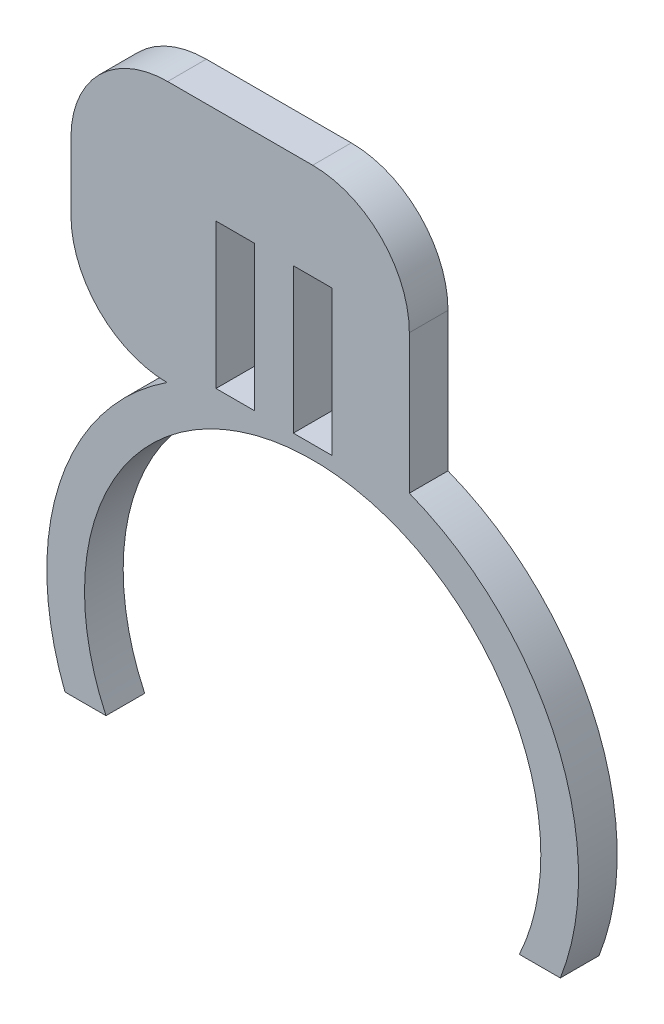
ISO-10303-21;
HEADER;
FILE_DESCRIPTION(('STEP AP214'),'2;1');
FILE_NAME('part.step','',(''),(''),'','','');
FILE_SCHEMA(('AUTOMOTIVE_DESIGN { 1 0 10303 214 1 1 1 1 }'));
ENDSEC;
DATA;
#1=APPLICATION_CONTEXT('core data for automotive mechanical design processes');
#2=APPLICATION_PROTOCOL_DEFINITION('international standard','automotive_design',2000,#1);
#3=PRODUCT_CONTEXT('',#1,'mechanical');
#4=PRODUCT('Part','Part','',(#3));
#5=PRODUCT_RELATED_PRODUCT_CATEGORY('part','',(#4));
#6=PRODUCT_DEFINITION_FORMATION('','',#4);
#7=PRODUCT_DEFINITION_CONTEXT('part definition',#1,'design');
#8=PRODUCT_DEFINITION('design','',#6,#7);
#9=PRODUCT_DEFINITION_SHAPE('','',#8);
#10=(LENGTH_UNIT() NAMED_UNIT(*) SI_UNIT(.MILLI.,.METRE.));
#11=(NAMED_UNIT(*) PLANE_ANGLE_UNIT() SI_UNIT($,.RADIAN.));
#12=(NAMED_UNIT(*) SI_UNIT($,.STERADIAN.) SOLID_ANGLE_UNIT());
#13=UNCERTAINTY_MEASURE_WITH_UNIT(LENGTH_MEASURE(1.E-05),#10,'distance_accuracy_value','');
#14=(GEOMETRIC_REPRESENTATION_CONTEXT(3) GLOBAL_UNCERTAINTY_ASSIGNED_CONTEXT((#13)) GLOBAL_UNIT_ASSIGNED_CONTEXT((#10,
#11,#12)) REPRESENTATION_CONTEXT('',''));
#15=CARTESIAN_POINT('',(0.,0.,0.));
#16=DIRECTION('',(0.,0.,1.));
#17=DIRECTION('',(1.,0.,0.));
#18=AXIS2_PLACEMENT_3D('',#15,#16,#17);
#19=CARTESIAN_POINT('',(0.,0.,5.08));
#20=DIRECTION('',(0.,0.,-1.));
#21=DIRECTION('',(-1.,0.,0.));
#22=AXIS2_PLACEMENT_3D('',#19,#20,#21);
#23=CYLINDRICAL_SURFACE('',#22,34.925);
#24=DIRECTION('',(0.,0.,-1.));
#25=VECTOR('',#24,1.);
#26=CARTESIAN_POINT('',(-19.1450130582353,29.21,5.08));
#27=LINE('',#26,#25);
#28=CARTESIAN_POINT('',(-19.1450130582353,29.21,0.));
#29=VERTEX_POINT('',#28);
#30=CARTESIAN_POINT('',(-19.1450130582353,29.21,5.08));
#31=VERTEX_POINT('',#30);
#32=EDGE_CURVE('E215',#29,#31,#27,.F.);
#33=ORIENTED_EDGE('',*,*,#32,.F.);
#34=CARTESIAN_POINT('',(0.,0.,0.));
#35=DIRECTION('',(0.,0.,1.));
#36=DIRECTION('',(1.,0.,0.));
#37=AXIS2_PLACEMENT_3D('',#34,#35,#36);
#38=CIRCLE('',#37,34.925);
#39=CARTESIAN_POINT('',(-32.5340686819217,-12.7,0.));
#40=VERTEX_POINT('',#39);
#41=EDGE_CURVE('E283',#29,#40,#38,.T.);
#42=ORIENTED_EDGE('',*,*,#41,.T.);
#43=DIRECTION('',(0.,0.,-1.));
#44=VECTOR('',#43,1.);
#45=CARTESIAN_POINT('',(-32.5340686819217,-12.7,5.08));
#46=LINE('',#45,#44);
#47=CARTESIAN_POINT('',(-32.5340686819217,-12.7,5.08));
#48=VERTEX_POINT('',#47);
#49=EDGE_CURVE('E223',#40,#48,#46,.F.);
#50=ORIENTED_EDGE('',*,*,#49,.T.);
#51=CARTESIAN_POINT('',(0.,0.,5.08));
#52=DIRECTION('',(0.,0.,1.));
#53=DIRECTION('',(1.,0.,0.));
#54=AXIS2_PLACEMENT_3D('',#51,#52,#53);
#55=CIRCLE('',#54,34.925);
#56=EDGE_CURVE('E279',#31,#48,#55,.T.);
#57=ORIENTED_EDGE('',*,*,#56,.F.);
#58=EDGE_LOOP('',(#33,#42,#50,#57));
#59=FACE_BOUND('',#58,.T.);
#60=ADVANCED_FACE('F34',(#59),#23,.T.);
#61=CARTESIAN_POINT('',(32.5340686819217,-12.6999999999999,5.08));
#62=VERTEX_POINT('',#61);
#63=CARTESIAN_POINT('',(12.7,32.5340686819218,5.08));
#64=VERTEX_POINT('',#63);
#65=EDGE_CURVE('E282',#62,#64,#55,.T.);
#66=ORIENTED_EDGE('',*,*,#65,.F.);
#67=DIRECTION('',(0.,0.,-1.));
#68=VECTOR('',#67,1.);
#69=CARTESIAN_POINT('',(32.5340686819217,-12.6999999999999,5.08));
#70=LINE('',#69,#68);
#71=CARTESIAN_POINT('',(32.5340686819217,-12.6999999999999,0.));
#72=VERTEX_POINT('',#71);
#73=EDGE_CURVE('E227',#62,#72,#70,.T.);
#74=ORIENTED_EDGE('',*,*,#73,.T.);
#75=CARTESIAN_POINT('',(12.7,32.5340686819218,0.));
#76=VERTEX_POINT('',#75);
#77=EDGE_CURVE('E278',#72,#76,#38,.T.);
#78=ORIENTED_EDGE('',*,*,#77,.T.);
#79=DIRECTION('',(0.,0.,-1.));
#80=VECTOR('',#79,1.);
#81=CARTESIAN_POINT('',(12.7,32.5340686819218,5.08));
#82=LINE('',#81,#80);
#83=EDGE_CURVE('E275',#64,#76,#82,.T.);
#84=ORIENTED_EDGE('',*,*,#83,.F.);
#85=EDGE_LOOP('',(#66,#74,#78,#84));
#86=FACE_BOUND('',#85,.T.);
#87=ADVANCED_FACE('F338',(#86),#23,.T.);
#88=CARTESIAN_POINT('',(0.,0.,5.08));
#89=DIRECTION('',(0.,0.,1.));
#90=DIRECTION('',(1.,0.,0.));
#91=AXIS2_PLACEMENT_3D('',#88,#89,#90);
#92=PLANE('',#91);
#93=DIRECTION('',(0.,1.,0.));
#94=VECTOR('',#93,1.);
#95=CARTESIAN_POINT('',(-7.62000000000002,0.,5.08));
#96=LINE('',#95,#94);
#97=CARTESIAN_POINT('',(-7.62000000000002,31.75,5.08));
#98=VERTEX_POINT('',#97);
#99=CARTESIAN_POINT('',(-7.62000000000004,50.8000000000001,5.08));
#100=VERTEX_POINT('',#99);
#101=EDGE_CURVE('E208',#98,#100,#96,.T.);
#102=ORIENTED_EDGE('',*,*,#101,.F.);
#103=DIRECTION('',(1.,0.,0.));
#104=VECTOR('',#103,1.);
#105=CARTESIAN_POINT('',(0.,31.7500000000001,5.08));
#106=LINE('',#105,#104);
#107=CARTESIAN_POINT('',(-12.7,31.75,5.08));
#108=VERTEX_POINT('',#107);
#109=EDGE_CURVE('E201',#108,#98,#106,.T.);
#110=ORIENTED_EDGE('',*,*,#109,.F.);
#111=DIRECTION('',(0.,-1.,0.));
#112=VECTOR('',#111,1.);
#113=CARTESIAN_POINT('',(-12.7,1.11022302462516E-13,5.08));
#114=LINE('',#113,#112);
#115=CARTESIAN_POINT('',(-12.7,50.8000000000001,5.08));
#116=VERTEX_POINT('',#115);
#117=EDGE_CURVE('E176',#116,#108,#114,.T.);
#118=ORIENTED_EDGE('',*,*,#117,.F.);
#119=DIRECTION('',(-1.,0.,0.));
#120=VECTOR('',#119,1.);
#121=CARTESIAN_POINT('',(0.,50.8,5.08));
#122=LINE('',#121,#120);
#123=EDGE_CURVE('E206',#100,#116,#122,.T.);
#124=ORIENTED_EDGE('',*,*,#123,.F.);
#125=EDGE_LOOP('',(#102,#110,#118,#124));
#126=FACE_BOUND('',#125,.T.);
#127=DIRECTION('',(0.,-1.,0.));
#128=VECTOR('',#127,1.);
#129=CARTESIAN_POINT('',(12.7,63.5,5.08));
#130=LINE('',#129,#128);
#131=CARTESIAN_POINT('',(12.7,50.8,5.08));
#132=VERTEX_POINT('',#131);
#133=EDGE_CURVE('E271',#132,#64,#130,.T.);
#134=ORIENTED_EDGE('',*,*,#133,.F.);
#135=CARTESIAN_POINT('',(0.,50.8,5.08));
#136=DIRECTION('',(0.,0.,1.));
#137=DIRECTION('',(1.,0.,0.));
#138=AXIS2_PLACEMENT_3D('',#135,#136,#137);
#139=CIRCLE('',#138,12.7);
#140=CARTESIAN_POINT('',(0.,63.4999999999999,5.08));
#141=VERTEX_POINT('',#140);
#142=EDGE_CURVE('E305',#132,#141,#139,.T.);
#143=ORIENTED_EDGE('',*,*,#142,.T.);
#144=DIRECTION('',(1.,0.,0.));
#145=VECTOR('',#144,1.);
#146=CARTESIAN_POINT('',(-12.7,63.5,5.08));
#147=LINE('',#146,#145);
#148=CARTESIAN_POINT('',(-19.05,63.5,5.08));
#149=VERTEX_POINT('',#148);
#150=EDGE_CURVE('E268',#149,#141,#147,.T.);
#151=ORIENTED_EDGE('',*,*,#150,.F.);
#152=CARTESIAN_POINT('',(-19.05,50.8,5.08));
#153=DIRECTION('',(0.,0.,1.));
#154=DIRECTION('',(1.,0.,0.));
#155=AXIS2_PLACEMENT_3D('',#152,#153,#154);
#156=CIRCLE('',#155,12.7);
#157=CARTESIAN_POINT('',(-31.7500000000001,50.8,5.08));
#158=VERTEX_POINT('',#157);
#159=EDGE_CURVE('E49',#149,#158,#156,.T.);
#160=ORIENTED_EDGE('',*,*,#159,.T.);
#161=DIRECTION('',(0.,1.,0.));
#162=VECTOR('',#161,1.);
#163=CARTESIAN_POINT('',(-31.75,63.5,5.08));
#164=LINE('',#163,#162);
#165=CARTESIAN_POINT('',(-31.7500000000001,41.9096445823797,5.08));
#166=VERTEX_POINT('',#165);
#167=EDGE_CURVE('E213',#166,#158,#164,.T.);
#168=ORIENTED_EDGE('',*,*,#167,.F.);
#169=CARTESIAN_POINT('',(-19.05,41.9096445823797,5.08));
#170=DIRECTION('',(0.,0.,1.));
#171=DIRECTION('',(1.,0.,0.));
#172=AXIS2_PLACEMENT_3D('',#169,#170,#171);
#173=CIRCLE('',#172,12.7);
#174=EDGE_CURVE('E57',#166,#31,#173,.T.);
#175=ORIENTED_EDGE('',*,*,#174,.T.);
#176=ORIENTED_EDGE('',*,*,#56,.T.);
#177=DIRECTION('',(-1.,0.,0.));
#178=VECTOR('',#177,1.);
#179=CARTESIAN_POINT('',(0.,-12.6999999999999,5.08));
#180=LINE('',#179,#178);
#181=CARTESIAN_POINT('',(-27.1483108866832,-12.6999999999999,5.08));
#182=VERTEX_POINT('',#181);
#183=EDGE_CURVE('E220',#182,#48,#180,.T.);
#184=ORIENTED_EDGE('',*,*,#183,.F.);
#185=CARTESIAN_POINT('',(0.,0.,5.08));
#186=DIRECTION('',(0.,0.,1.));
#187=DIRECTION('',(1.,0.,0.));
#188=AXIS2_PLACEMENT_3D('',#185,#186,#187);
#189=CIRCLE('',#188,29.972);
#190=CARTESIAN_POINT('',(27.1483108866831,-12.6999999999999,5.08));
#191=VERTEX_POINT('',#190);
#192=EDGE_CURVE('E262',#191,#182,#189,.T.);
#193=ORIENTED_EDGE('',*,*,#192,.F.);
#194=EDGE_CURVE('E224',#62,#191,#180,.T.);
#195=ORIENTED_EDGE('',*,*,#194,.F.);
#196=ORIENTED_EDGE('',*,*,#65,.T.);
#197=EDGE_LOOP('',(#134,#143,#151,#160,#168,#175,#176,#184,#193,#195,#196));
#198=FACE_BOUND('',#197,.T.);
#199=DIRECTION('',(0.,1.,0.));
#200=VECTOR('',#199,1.);
#201=CARTESIAN_POINT('',(2.53999999999999,1.11022302462516E-13,5.08));
#202=LINE('',#201,#200);
#203=CARTESIAN_POINT('',(2.53999999999999,31.7500000000001,5.08));
#204=VERTEX_POINT('',#203);
#205=CARTESIAN_POINT('',(2.53999999999999,50.8,5.08));
#206=VERTEX_POINT('',#205);
#207=EDGE_CURVE('E257',#204,#206,#202,.T.);
#208=ORIENTED_EDGE('',*,*,#207,.F.);
#209=DIRECTION('',(1.,0.,0.));
#210=VECTOR('',#209,1.);
#211=CARTESIAN_POINT('',(0.,31.7500000000001,5.08));
#212=LINE('',#211,#210);
#213=CARTESIAN_POINT('',(-2.54000000000001,31.75,5.08));
#214=VERTEX_POINT('',#213);
#215=EDGE_CURVE('E244',#214,#204,#212,.T.);
#216=ORIENTED_EDGE('',*,*,#215,.F.);
#217=DIRECTION('',(0.,-1.,0.));
#218=VECTOR('',#217,1.);
#219=CARTESIAN_POINT('',(-2.54000000000001,0.,5.08));
#220=LINE('',#219,#218);
#221=CARTESIAN_POINT('',(-2.54000000000001,50.8,5.08));
#222=VERTEX_POINT('',#221);
#223=EDGE_CURVE('E252',#222,#214,#220,.T.);
#224=ORIENTED_EDGE('',*,*,#223,.F.);
#225=DIRECTION('',(-1.,0.,0.));
#226=VECTOR('',#225,1.);
#227=CARTESIAN_POINT('',(0.,50.8,5.08));
#228=LINE('',#227,#226);
#229=EDGE_CURVE('E255',#206,#222,#228,.T.);
#230=ORIENTED_EDGE('',*,*,#229,.F.);
#231=EDGE_LOOP('',(#208,#216,#224,#230));
#232=FACE_BOUND('',#231,.T.);
#233=ADVANCED_FACE('F312',(#126,#198,#232),#92,.T.);
#234=CARTESIAN_POINT('',(0.,0.,0.));
#235=DIRECTION('',(0.,0.,1.));
#236=DIRECTION('',(1.,0.,0.));
#237=AXIS2_PLACEMENT_3D('',#234,#235,#236);
#238=PLANE('',#237);
#239=DIRECTION('',(-1.,0.,0.));
#240=VECTOR('',#239,1.);
#241=CARTESIAN_POINT('',(-7.62000000000002,31.75,0.));
#242=LINE('',#241,#240);
#243=CARTESIAN_POINT('',(-7.62000000000002,31.75,0.));
#244=VERTEX_POINT('',#243);
#245=CARTESIAN_POINT('',(-12.7,31.75,0.));
#246=VERTEX_POINT('',#245);
#247=EDGE_CURVE('E184',#244,#246,#242,.T.);
#248=ORIENTED_EDGE('',*,*,#247,.F.);
#249=DIRECTION('',(0.,-1.,0.));
#250=VECTOR('',#249,1.);
#251=CARTESIAN_POINT('',(-7.62000000000002,31.75,0.));
#252=LINE('',#251,#250);
#253=CARTESIAN_POINT('',(-7.62000000000004,50.8000000000001,0.));
#254=VERTEX_POINT('',#253);
#255=EDGE_CURVE('E189',#254,#244,#252,.T.);
#256=ORIENTED_EDGE('',*,*,#255,.F.);
#257=DIRECTION('',(1.,0.,0.));
#258=VECTOR('',#257,1.);
#259=CARTESIAN_POINT('',(-7.62000000000004,50.8000000000001,0.));
#260=LINE('',#259,#258);
#261=CARTESIAN_POINT('',(-12.7,50.8000000000001,0.));
#262=VERTEX_POINT('',#261);
#263=EDGE_CURVE('E194',#262,#254,#260,.T.);
#264=ORIENTED_EDGE('',*,*,#263,.F.);
#265=DIRECTION('',(0.,1.,0.));
#266=VECTOR('',#265,1.);
#267=CARTESIAN_POINT('',(-12.7,31.75,0.));
#268=LINE('',#267,#266);
#269=EDGE_CURVE('E173',#246,#262,#268,.T.);
#270=ORIENTED_EDGE('',*,*,#269,.F.);
#271=EDGE_LOOP('',(#248,#256,#264,#270));
#272=FACE_BOUND('',#271,.T.);
#273=DIRECTION('',(-1.,0.,0.));
#274=VECTOR('',#273,1.);
#275=CARTESIAN_POINT('',(-12.7,63.5,0.));
#276=LINE('',#275,#274);
#277=CARTESIAN_POINT('',(0.,63.4999999999999,0.));
#278=VERTEX_POINT('',#277);
#279=CARTESIAN_POINT('',(-19.05,63.5,0.));
#280=VERTEX_POINT('',#279);
#281=EDGE_CURVE('E265',#278,#280,#276,.T.);
#282=ORIENTED_EDGE('',*,*,#281,.F.);
#283=CARTESIAN_POINT('',(0.,50.8,0.));
#284=DIRECTION('',(0.,0.,1.));
#285=DIRECTION('',(1.,0.,0.));
#286=AXIS2_PLACEMENT_3D('',#283,#284,#285);
#287=CIRCLE('',#286,12.7);
#288=CARTESIAN_POINT('',(12.7,50.8,0.));
#289=VERTEX_POINT('',#288);
#290=EDGE_CURVE('E299',#278,#289,#287,.F.);
#291=ORIENTED_EDGE('',*,*,#290,.T.);
#292=DIRECTION('',(0.,-1.,0.));
#293=VECTOR('',#292,1.);
#294=CARTESIAN_POINT('',(12.7,63.5,0.));
#295=LINE('',#294,#293);
#296=EDGE_CURVE('E273',#289,#76,#295,.T.);
#297=ORIENTED_EDGE('',*,*,#296,.T.);
#298=ORIENTED_EDGE('',*,*,#77,.F.);
#299=DIRECTION('',(1.,0.,0.));
#300=VECTOR('',#299,1.);
#301=CARTESIAN_POINT('',(-65.502632377882,-12.6999999999999,0.));
#302=LINE('',#301,#300);
#303=CARTESIAN_POINT('',(27.1483108866831,-12.6999999999999,0.));
#304=VERTEX_POINT('',#303);
#305=EDGE_CURVE('E217',#304,#72,#302,.T.);
#306=ORIENTED_EDGE('',*,*,#305,.F.);
#307=CARTESIAN_POINT('',(0.,0.,0.));
#308=DIRECTION('',(0.,0.,-1.));
#309=DIRECTION('',(-1.,0.,0.));
#310=AXIS2_PLACEMENT_3D('',#307,#308,#309);
#311=CIRCLE('',#310,29.972);
#312=CARTESIAN_POINT('',(-27.1483108866832,-12.6999999999999,0.));
#313=VERTEX_POINT('',#312);
#314=EDGE_CURVE('E259',#313,#304,#311,.T.);
#315=ORIENTED_EDGE('',*,*,#314,.F.);
#316=EDGE_CURVE('E219',#40,#313,#302,.T.);
#317=ORIENTED_EDGE('',*,*,#316,.F.);
#318=ORIENTED_EDGE('',*,*,#41,.F.);
#319=CARTESIAN_POINT('',(-19.05,41.9096445823797,0.));
#320=DIRECTION('',(0.,0.,1.));
#321=DIRECTION('',(1.,0.,0.));
#322=AXIS2_PLACEMENT_3D('',#319,#320,#321);
#323=CIRCLE('',#322,12.7);
#324=CARTESIAN_POINT('',(-31.7500000000001,41.9096445823797,0.));
#325=VERTEX_POINT('',#324);
#326=EDGE_CURVE('E295',#29,#325,#323,.F.);
#327=ORIENTED_EDGE('',*,*,#326,.T.);
#328=DIRECTION('',(0.,-1.,0.));
#329=VECTOR('',#328,1.);
#330=CARTESIAN_POINT('',(-31.75,63.5,0.));
#331=LINE('',#330,#329);
#332=CARTESIAN_POINT('',(-31.7500000000001,50.8,0.));
#333=VERTEX_POINT('',#332);
#334=EDGE_CURVE('E210',#333,#325,#331,.T.);
#335=ORIENTED_EDGE('',*,*,#334,.F.);
#336=CARTESIAN_POINT('',(-19.05,50.8,0.));
#337=DIRECTION('',(0.,0.,1.));
#338=DIRECTION('',(1.,0.,0.));
#339=AXIS2_PLACEMENT_3D('',#336,#337,#338);
#340=CIRCLE('',#339,12.7);
#341=EDGE_CURVE('E297',#333,#280,#340,.F.);
#342=ORIENTED_EDGE('',*,*,#341,.T.);
#343=EDGE_LOOP('',(#282,#291,#297,#298,#306,#315,#317,#318,#327,#335,#342));
#344=FACE_BOUND('',#343,.T.);
#345=DIRECTION('',(-1.,0.,0.));
#346=VECTOR('',#345,1.);
#347=CARTESIAN_POINT('',(-2.54000000000001,31.75,0.));
#348=LINE('',#347,#346);
#349=CARTESIAN_POINT('',(2.53999999999999,31.7500000000001,0.));
#350=VERTEX_POINT('',#349);
#351=CARTESIAN_POINT('',(-2.54000000000001,31.75,0.));
#352=VERTEX_POINT('',#351);
#353=EDGE_CURVE('E232',#350,#352,#348,.T.);
#354=ORIENTED_EDGE('',*,*,#353,.F.);
#355=DIRECTION('',(0.,-1.,0.));
#356=VECTOR('',#355,1.);
#357=CARTESIAN_POINT('',(2.53999999999999,50.8,0.));
#358=LINE('',#357,#356);
#359=CARTESIAN_POINT('',(2.53999999999999,50.8,0.));
#360=VERTEX_POINT('',#359);
#361=EDGE_CURVE('E230',#360,#350,#358,.T.);
#362=ORIENTED_EDGE('',*,*,#361,.F.);
#363=DIRECTION('',(1.,0.,0.));
#364=VECTOR('',#363,1.);
#365=CARTESIAN_POINT('',(-2.54000000000001,50.8,0.));
#366=LINE('',#365,#364);
#367=CARTESIAN_POINT('',(-2.54000000000001,50.8,0.));
#368=VERTEX_POINT('',#367);
#369=EDGE_CURVE('E238',#368,#360,#366,.T.);
#370=ORIENTED_EDGE('',*,*,#369,.F.);
#371=DIRECTION('',(0.,1.,0.));
#372=VECTOR('',#371,1.);
#373=CARTESIAN_POINT('',(-2.54000000000001,50.8,0.));
#374=LINE('',#373,#372);
#375=EDGE_CURVE('E235',#352,#368,#374,.T.);
#376=ORIENTED_EDGE('',*,*,#375,.F.);
#377=EDGE_LOOP('',(#354,#362,#370,#376));
#378=FACE_BOUND('',#377,.T.);
#379=ADVANCED_FACE('F191',(#272,#344,#378),#238,.F.);
#380=CARTESIAN_POINT('',(12.7,63.5,0.));
#381=DIRECTION('',(-1.,0.,0.));
#382=DIRECTION('',(0.,0.,1.));
#383=AXIS2_PLACEMENT_3D('',#380,#381,#382);
#384=PLANE('',#383);
#385=ORIENTED_EDGE('',*,*,#296,.F.);
#386=DIRECTION('',(0.,0.,-1.));
#387=VECTOR('',#386,1.);
#388=CARTESIAN_POINT('',(12.7,50.8,5.08));
#389=LINE('',#388,#387);
#390=EDGE_CURVE('E301',#289,#132,#389,.F.);
#391=ORIENTED_EDGE('',*,*,#390,.T.);
#392=ORIENTED_EDGE('',*,*,#133,.T.);
#393=ORIENTED_EDGE('',*,*,#83,.T.);
#394=EDGE_LOOP('',(#385,#391,#392,#393));
#395=FACE_BOUND('',#394,.T.);
#396=ADVANCED_FACE('F340',(#395),#384,.F.);
#397=CARTESIAN_POINT('',(0.,63.4999999999999,0.));
#398=DIRECTION('',(0.,1.,0.));
#399=DIRECTION('',(0.,0.,1.));
#400=AXIS2_PLACEMENT_3D('',#397,#398,#399);
#401=PLANE('',#400);
#402=ORIENTED_EDGE('',*,*,#150,.T.);
#403=DIRECTION('',(0.,0.,-1.));
#404=VECTOR('',#403,1.);
#405=CARTESIAN_POINT('',(0.,63.4999999999999,0.));
#406=LINE('',#405,#404);
#407=EDGE_CURVE('E292',#141,#278,#406,.T.);
#408=ORIENTED_EDGE('',*,*,#407,.T.);
#409=ORIENTED_EDGE('',*,*,#281,.T.);
#410=DIRECTION('',(0.,0.,-1.));
#411=VECTOR('',#410,1.);
#412=CARTESIAN_POINT('',(-19.05,63.5,0.));
#413=LINE('',#412,#411);
#414=EDGE_CURVE('E290',#280,#149,#413,.F.);
#415=ORIENTED_EDGE('',*,*,#414,.T.);
#416=EDGE_LOOP('',(#402,#408,#409,#415));
#417=FACE_BOUND('',#416,.T.);
#418=ADVANCED_FACE('F348',(#417),#401,.T.);
#419=CARTESIAN_POINT('',(0.,0.,50.8));
#420=DIRECTION('',(0.,0.,-1.));
#421=DIRECTION('',(-1.,0.,0.));
#422=AXIS2_PLACEMENT_3D('',#419,#420,#421);
#423=CYLINDRICAL_SURFACE('',#422,29.972);
#424=ORIENTED_EDGE('',*,*,#314,.T.);
#425=DIRECTION('',(0.,0.,-1.));
#426=VECTOR('',#425,1.);
#427=CARTESIAN_POINT('',(27.1483108866831,-12.6999999999999,50.8));
#428=LINE('',#427,#426);
#429=EDGE_CURVE('E287',#304,#191,#428,.F.);
#430=ORIENTED_EDGE('',*,*,#429,.T.);
#431=ORIENTED_EDGE('',*,*,#192,.T.);
#432=DIRECTION('',(0.,0.,-1.));
#433=VECTOR('',#432,1.);
#434=CARTESIAN_POINT('',(-27.1483108866832,-12.6999999999999,50.8));
#435=LINE('',#434,#433);
#436=EDGE_CURVE('E281',#182,#313,#435,.T.);
#437=ORIENTED_EDGE('',*,*,#436,.T.);
#438=EDGE_LOOP('',(#424,#430,#431,#437));
#439=FACE_BOUND('',#438,.T.);
#440=ADVANCED_FACE('F328',(#439),#423,.F.);
#441=CARTESIAN_POINT('',(2.53999999999999,50.8,50.8));
#442=DIRECTION('',(1.,0.,0.));
#443=DIRECTION('',(0.,1.,0.));
#444=AXIS2_PLACEMENT_3D('',#441,#442,#443);
#445=PLANE('',#444);
#446=ORIENTED_EDGE('',*,*,#207,.T.);
#447=DIRECTION('',(0.,0.,-1.));
#448=VECTOR('',#447,1.);
#449=CARTESIAN_POINT('',(2.53999999999999,50.8,50.8));
#450=LINE('',#449,#448);
#451=EDGE_CURVE('E242',#206,#360,#450,.T.);
#452=ORIENTED_EDGE('',*,*,#451,.T.);
#453=ORIENTED_EDGE('',*,*,#361,.T.);
#454=DIRECTION('',(0.,0.,-1.));
#455=VECTOR('',#454,1.);
#456=CARTESIAN_POINT('',(2.53999999999999,31.7500000000001,50.8));
#457=LINE('',#456,#455);
#458=EDGE_CURVE('E241',#204,#350,#457,.T.);
#459=ORIENTED_EDGE('',*,*,#458,.F.);
#460=EDGE_LOOP('',(#446,#452,#453,#459));
#461=FACE_BOUND('',#460,.T.);
#462=ADVANCED_FACE('F375',(#461),#445,.F.);
#463=CARTESIAN_POINT('',(-2.54000000000001,50.8,50.8));
#464=DIRECTION('',(0.,1.,0.));
#465=DIRECTION('',(0.,0.,1.));
#466=AXIS2_PLACEMENT_3D('',#463,#464,#465);
#467=PLANE('',#466);
#468=ORIENTED_EDGE('',*,*,#229,.T.);
#469=DIRECTION('',(0.,0.,-1.));
#470=VECTOR('',#469,1.);
#471=CARTESIAN_POINT('',(-2.54000000000001,50.8,50.8));
#472=LINE('',#471,#470);
#473=EDGE_CURVE('E245',#222,#368,#472,.T.);
#474=ORIENTED_EDGE('',*,*,#473,.T.);
#475=ORIENTED_EDGE('',*,*,#369,.T.);
#476=ORIENTED_EDGE('',*,*,#451,.F.);
#477=EDGE_LOOP('',(#468,#474,#475,#476));
#478=FACE_BOUND('',#477,.T.);
#479=ADVANCED_FACE('F378',(#478),#467,.F.);
#480=CARTESIAN_POINT('',(-2.54000000000001,50.8,50.8));
#481=DIRECTION('',(-1.,0.,0.));
#482=DIRECTION('',(0.,-1.,0.));
#483=AXIS2_PLACEMENT_3D('',#480,#481,#482);
#484=PLANE('',#483);
#485=ORIENTED_EDGE('',*,*,#223,.T.);
#486=DIRECTION('',(0.,0.,-1.));
#487=VECTOR('',#486,1.);
#488=CARTESIAN_POINT('',(-2.54000000000001,31.75,50.8));
#489=LINE('',#488,#487);
#490=EDGE_CURVE('E247',#214,#352,#489,.T.);
#491=ORIENTED_EDGE('',*,*,#490,.T.);
#492=ORIENTED_EDGE('',*,*,#375,.T.);
#493=ORIENTED_EDGE('',*,*,#473,.F.);
#494=EDGE_LOOP('',(#485,#491,#492,#493));
#495=FACE_BOUND('',#494,.T.);
#496=ADVANCED_FACE('F383',(#495),#484,.F.);
#497=CARTESIAN_POINT('',(-2.54000000000001,31.75,50.8));
#498=DIRECTION('',(0.,-1.,0.));
#499=DIRECTION('',(0.,0.,-1.));
#500=AXIS2_PLACEMENT_3D('',#497,#498,#499);
#501=PLANE('',#500);
#502=ORIENTED_EDGE('',*,*,#215,.T.);
#503=ORIENTED_EDGE('',*,*,#458,.T.);
#504=ORIENTED_EDGE('',*,*,#353,.T.);
#505=ORIENTED_EDGE('',*,*,#490,.F.);
#506=EDGE_LOOP('',(#502,#503,#504,#505));
#507=FACE_BOUND('',#506,.T.);
#508=ADVANCED_FACE('F380',(#507),#501,.F.);
#509=CARTESIAN_POINT('',(-65.502632377882,-12.6999999999999,50.8));
#510=DIRECTION('',(0.,1.,0.));
#511=DIRECTION('',(-1.,0.,0.));
#512=AXIS2_PLACEMENT_3D('',#509,#510,#511);
#513=PLANE('',#512);
#514=ORIENTED_EDGE('',*,*,#316,.T.);
#515=ORIENTED_EDGE('',*,*,#436,.F.);
#516=ORIENTED_EDGE('',*,*,#183,.T.);
#517=ORIENTED_EDGE('',*,*,#49,.F.);
#518=EDGE_LOOP('',(#514,#515,#516,#517));
#519=FACE_BOUND('',#518,.T.);
#520=ADVANCED_FACE('F324',(#519),#513,.F.);
#521=ORIENTED_EDGE('',*,*,#194,.T.);
#522=ORIENTED_EDGE('',*,*,#429,.F.);
#523=ORIENTED_EDGE('',*,*,#305,.T.);
#524=ORIENTED_EDGE('',*,*,#73,.F.);
#525=EDGE_LOOP('',(#521,#522,#523,#524));
#526=FACE_BOUND('',#525,.T.);
#527=ADVANCED_FACE('F331',(#526),#513,.F.);
#528=CARTESIAN_POINT('',(-31.75,0.,0.));
#529=DIRECTION('',(-1.,0.,0.));
#530=DIRECTION('',(0.,0.,1.));
#531=AXIS2_PLACEMENT_3D('',#528,#529,#530);
#532=PLANE('',#531);
#533=ORIENTED_EDGE('',*,*,#167,.T.);
#534=DIRECTION('',(0.,0.,-1.));
#535=VECTOR('',#534,1.);
#536=CARTESIAN_POINT('',(-31.7500000000001,50.8,0.));
#537=LINE('',#536,#535);
#538=EDGE_CURVE('E11',#158,#333,#537,.T.);
#539=ORIENTED_EDGE('',*,*,#538,.T.);
#540=ORIENTED_EDGE('',*,*,#334,.T.);
#541=DIRECTION('',(0.,0.,1.));
#542=VECTOR('',#541,1.);
#543=CARTESIAN_POINT('',(-31.7500000000001,41.9096445823797,5.08));
#544=LINE('',#543,#542);
#545=EDGE_CURVE('E42',#325,#166,#544,.T.);
#546=ORIENTED_EDGE('',*,*,#545,.T.);
#547=EDGE_LOOP('',(#533,#539,#540,#546));
#548=FACE_BOUND('',#547,.T.);
#549=ADVANCED_FACE('F307',(#548),#532,.T.);
#550=CARTESIAN_POINT('',(-7.62000000000002,31.75,19.05));
#551=DIRECTION('',(0.999999999999999,0.,0.));
#552=DIRECTION('',(0.,0.,-1.));
#553=AXIS2_PLACEMENT_3D('',#550,#551,#552);
#554=PLANE('',#553);
#555=ORIENTED_EDGE('',*,*,#101,.T.);
#556=DIRECTION('',(0.,0.,-1.));
#557=VECTOR('',#556,1.);
#558=CARTESIAN_POINT('',(-7.62000000000004,50.8000000000001,19.05));
#559=LINE('',#558,#557);
#560=EDGE_CURVE('E199',#100,#254,#559,.T.);
#561=ORIENTED_EDGE('',*,*,#560,.T.);
#562=ORIENTED_EDGE('',*,*,#255,.T.);
#563=DIRECTION('',(0.,0.,-1.));
#564=VECTOR('',#563,1.);
#565=CARTESIAN_POINT('',(-7.62000000000002,31.75,19.05));
#566=LINE('',#565,#564);
#567=EDGE_CURVE('E180',#98,#244,#566,.T.);
#568=ORIENTED_EDGE('',*,*,#567,.F.);
#569=EDGE_LOOP('',(#555,#561,#562,#568));
#570=FACE_BOUND('',#569,.T.);
#571=ADVANCED_FACE('F395',(#570),#554,.F.);
#572=CARTESIAN_POINT('',(-7.62000000000004,50.8000000000001,19.05));
#573=DIRECTION('',(0.,0.999999999999999,0.));
#574=DIRECTION('',(0.,0.,1.));
#575=AXIS2_PLACEMENT_3D('',#572,#573,#574);
#576=PLANE('',#575);
#577=ORIENTED_EDGE('',*,*,#123,.T.);
#578=DIRECTION('',(0.,0.,-1.));
#579=VECTOR('',#578,1.);
#580=CARTESIAN_POINT('',(-12.7,50.8000000000001,19.05));
#581=LINE('',#580,#579);
#582=EDGE_CURVE('E179',#116,#262,#581,.T.);
#583=ORIENTED_EDGE('',*,*,#582,.T.);
#584=ORIENTED_EDGE('',*,*,#263,.T.);
#585=ORIENTED_EDGE('',*,*,#560,.F.);
#586=EDGE_LOOP('',(#577,#583,#584,#585));
#587=FACE_BOUND('',#586,.T.);
#588=ADVANCED_FACE('F398',(#587),#576,.F.);
#589=CARTESIAN_POINT('',(-12.7,31.75,19.05));
#590=DIRECTION('',(-0.999999999999999,0.,0.));
#591=DIRECTION('',(0.,0.,1.));
#592=AXIS2_PLACEMENT_3D('',#589,#590,#591);
#593=PLANE('',#592);
#594=ORIENTED_EDGE('',*,*,#117,.T.);
#595=DIRECTION('',(0.,0.,-1.));
#596=VECTOR('',#595,1.);
#597=CARTESIAN_POINT('',(-12.7,31.75,19.05));
#598=LINE('',#597,#596);
#599=EDGE_CURVE('E168',#108,#246,#598,.T.);
#600=ORIENTED_EDGE('',*,*,#599,.T.);
#601=ORIENTED_EDGE('',*,*,#269,.T.);
#602=ORIENTED_EDGE('',*,*,#582,.F.);
#603=EDGE_LOOP('',(#594,#600,#601,#602));
#604=FACE_BOUND('',#603,.T.);
#605=ADVANCED_FACE('F170',(#604),#593,.F.);
#606=CARTESIAN_POINT('',(-7.62000000000002,31.75,19.05));
#607=DIRECTION('',(0.,-0.999999999999999,0.));
#608=DIRECTION('',(0.,0.,-1.));
#609=AXIS2_PLACEMENT_3D('',#606,#607,#608);
#610=PLANE('',#609);
#611=ORIENTED_EDGE('',*,*,#109,.T.);
#612=ORIENTED_EDGE('',*,*,#567,.T.);
#613=ORIENTED_EDGE('',*,*,#247,.T.);
#614=ORIENTED_EDGE('',*,*,#599,.F.);
#615=EDGE_LOOP('',(#611,#612,#613,#614));
#616=FACE_BOUND('',#615,.T.);
#617=ADVANCED_FACE('F185',(#616),#610,.F.);
#618=CARTESIAN_POINT('',(0.,50.8,0.));
#619=DIRECTION('',(0.,0.,1.));
#620=DIRECTION('',(1.,0.,0.));
#621=AXIS2_PLACEMENT_3D('',#618,#619,#620);
#622=CYLINDRICAL_SURFACE('',#621,12.7);
#623=ORIENTED_EDGE('',*,*,#142,.F.);
#624=ORIENTED_EDGE('',*,*,#390,.F.);
#625=ORIENTED_EDGE('',*,*,#290,.F.);
#626=ORIENTED_EDGE('',*,*,#407,.F.);
#627=EDGE_LOOP('',(#623,#624,#625,#626));
#628=FACE_BOUND('',#627,.T.);
#629=ADVANCED_FACE('F346',(#628),#622,.T.);
#630=CARTESIAN_POINT('',(-19.05,50.8,0.));
#631=DIRECTION('',(0.,0.,-1.));
#632=DIRECTION('',(-1.,0.,0.));
#633=AXIS2_PLACEMENT_3D('',#630,#631,#632);
#634=CYLINDRICAL_SURFACE('',#633,12.7);
#635=ORIENTED_EDGE('',*,*,#159,.F.);
#636=ORIENTED_EDGE('',*,*,#414,.F.);
#637=ORIENTED_EDGE('',*,*,#341,.F.);
#638=ORIENTED_EDGE('',*,*,#538,.F.);
#639=EDGE_LOOP('',(#635,#636,#637,#638));
#640=FACE_BOUND('',#639,.T.);
#641=ADVANCED_FACE('F351',(#640),#634,.T.);
#642=CARTESIAN_POINT('',(-19.05,41.9096445823797,5.08));
#643=DIRECTION('',(0.,0.,-1.));
#644=DIRECTION('',(-1.,0.,0.));
#645=AXIS2_PLACEMENT_3D('',#642,#643,#644);
#646=CYLINDRICAL_SURFACE('',#645,12.7);
#647=ORIENTED_EDGE('',*,*,#326,.F.);
#648=ORIENTED_EDGE('',*,*,#32,.T.);
#649=ORIENTED_EDGE('',*,*,#174,.F.);
#650=ORIENTED_EDGE('',*,*,#545,.F.);
#651=EDGE_LOOP('',(#647,#648,#649,#650));
#652=FACE_BOUND('',#651,.T.);
#653=ADVANCED_FACE('F36',(#652),#646,.T.);
#654=CLOSED_SHELL('',(#60,#87,#233,#379,#396,#418,#440,#462,#479,#496,#508,#520,#527,#549,#571,
#588,#605,#617,#629,#641,#653));
#655=MANIFOLD_SOLID_BREP('B2',#654);
#656=ADVANCED_BREP_SHAPE_REPRESENTATION('',(#18,#655),#14);
#657=SHAPE_DEFINITION_REPRESENTATION(#9,#656);
ENDSEC;
END-ISO-10303-21;
